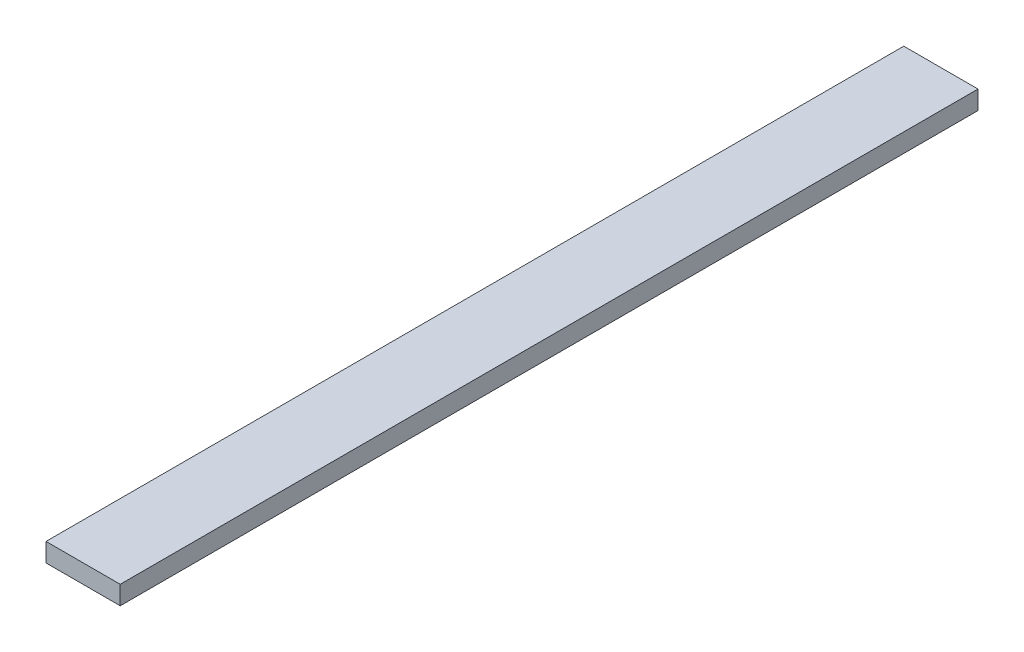
ISO-10303-21;
HEADER;
FILE_DESCRIPTION(('STEP AP214'),'2;1');
FILE_NAME('part.step','',(''),(''),'','','');
FILE_SCHEMA(('AUTOMOTIVE_DESIGN { 1 0 10303 214 1 1 1 1 }'));
ENDSEC;
DATA;
#1=APPLICATION_CONTEXT('core data for automotive mechanical design processes');
#2=APPLICATION_PROTOCOL_DEFINITION('international standard','automotive_design',2000,#1);
#3=PRODUCT_CONTEXT('',#1,'mechanical');
#4=PRODUCT('Part','Part','',(#3));
#5=PRODUCT_RELATED_PRODUCT_CATEGORY('part','',(#4));
#6=PRODUCT_DEFINITION_FORMATION('','',#4);
#7=PRODUCT_DEFINITION_CONTEXT('part definition',#1,'design');
#8=PRODUCT_DEFINITION('design','',#6,#7);
#9=PRODUCT_DEFINITION_SHAPE('','',#8);
#10=(LENGTH_UNIT() NAMED_UNIT(*) SI_UNIT(.MILLI.,.METRE.));
#11=(NAMED_UNIT(*) PLANE_ANGLE_UNIT() SI_UNIT($,.RADIAN.));
#12=(NAMED_UNIT(*) SI_UNIT($,.STERADIAN.) SOLID_ANGLE_UNIT());
#13=UNCERTAINTY_MEASURE_WITH_UNIT(LENGTH_MEASURE(1.E-05),#10,'distance_accuracy_value','');
#14=(GEOMETRIC_REPRESENTATION_CONTEXT(3) GLOBAL_UNCERTAINTY_ASSIGNED_CONTEXT((#13)) GLOBAL_UNIT_ASSIGNED_CONTEXT((#10,
#11,#12)) REPRESENTATION_CONTEXT('',''));
#15=CARTESIAN_POINT('',(0.,0.,0.));
#16=DIRECTION('',(0.,0.,1.));
#17=DIRECTION('',(1.,0.,0.));
#18=AXIS2_PLACEMENT_3D('',#15,#16,#17);
#19=CARTESIAN_POINT('',(234.890488297962,6.35963280943233,32.2183887861911));
#20=DIRECTION('',(0.,0.,-1.));
#21=DIRECTION('',(-1.,0.,0.));
#22=AXIS2_PLACEMENT_3D('',#19,#20,#21);
#23=PLANE('',#22);
#24=DIRECTION('',(1.,0.,0.));
#25=VECTOR('',#24,1.);
#26=CARTESIAN_POINT('',(234.890488297962,0.,32.2183887861911));
#27=LINE('',#26,#25);
#28=CARTESIAN_POINT('',(234.890488297962,0.,32.2183887861911));
#29=VERTEX_POINT('',#28);
#30=CARTESIAN_POINT('',(260.17856152416,0.,32.2183887861911));
#31=VERTEX_POINT('',#30);
#32=EDGE_CURVE('E96',#29,#31,#27,.T.);
#33=ORIENTED_EDGE('',*,*,#32,.T.);
#34=DIRECTION('',(0.,-1.,0.));
#35=VECTOR('',#34,1.);
#36=CARTESIAN_POINT('',(260.17856152416,6.35963280943233,32.2183887861911));
#37=LINE('',#36,#35);
#38=CARTESIAN_POINT('',(260.17856152416,6.35963280943233,32.2183887861911));
#39=VERTEX_POINT('',#38);
#40=EDGE_CURVE('E11',#39,#31,#37,.T.);
#41=ORIENTED_EDGE('',*,*,#40,.F.);
#42=DIRECTION('',(1.,0.,0.));
#43=VECTOR('',#42,1.);
#44=CARTESIAN_POINT('',(234.890488297962,6.35963280943233,32.2183887861911));
#45=LINE('',#44,#43);
#46=CARTESIAN_POINT('',(234.890488297962,6.35963280943233,32.2183887861911));
#47=VERTEX_POINT('',#46);
#48=EDGE_CURVE('E73',#47,#39,#45,.T.);
#49=ORIENTED_EDGE('',*,*,#48,.F.);
#50=DIRECTION('',(0.,-1.,0.));
#51=VECTOR('',#50,1.);
#52=CARTESIAN_POINT('',(234.890488297962,6.35963280943233,32.2183887861911));
#53=LINE('',#52,#51);
#54=EDGE_CURVE('E92',#47,#29,#53,.T.);
#55=ORIENTED_EDGE('',*,*,#54,.T.);
#56=EDGE_LOOP('',(#33,#41,#49,#55));
#57=FACE_BOUND('',#56,.T.);
#58=ADVANCED_FACE('F34',(#57),#23,.F.);
#59=CARTESIAN_POINT('',(260.17856152416,6.35963280943233,-260.051403775776));
#60=DIRECTION('',(1.,0.,0.));
#61=DIRECTION('',(0.,0.,-1.));
#62=AXIS2_PLACEMENT_3D('',#59,#60,#61);
#63=PLANE('',#62);
#64=DIRECTION('',(0.,0.,1.));
#65=VECTOR('',#64,1.);
#66=CARTESIAN_POINT('',(260.17856152416,0.,-260.051403775776));
#67=LINE('',#66,#65);
#68=CARTESIAN_POINT('',(260.17856152416,0.,-260.051403775776));
#69=VERTEX_POINT('',#68);
#70=EDGE_CURVE('E82',#69,#31,#67,.T.);
#71=ORIENTED_EDGE('',*,*,#70,.F.);
#72=DIRECTION('',(0.,-1.,0.));
#73=VECTOR('',#72,1.);
#74=CARTESIAN_POINT('',(260.17856152416,6.35963280943233,-260.051403775776));
#75=LINE('',#74,#73);
#76=CARTESIAN_POINT('',(260.17856152416,6.35963280943233,-260.051403775776));
#77=VERTEX_POINT('',#76);
#78=EDGE_CURVE('E42',#77,#69,#75,.T.);
#79=ORIENTED_EDGE('',*,*,#78,.F.);
#80=DIRECTION('',(0.,0.,1.));
#81=VECTOR('',#80,1.);
#82=CARTESIAN_POINT('',(260.17856152416,6.35963280943233,-260.051403775776));
#83=LINE('',#82,#81);
#84=EDGE_CURVE('E80',#77,#39,#83,.T.);
#85=ORIENTED_EDGE('',*,*,#84,.T.);
#86=ORIENTED_EDGE('',*,*,#40,.T.);
#87=EDGE_LOOP('',(#71,#79,#85,#86));
#88=FACE_BOUND('',#87,.T.);
#89=ADVANCED_FACE('F79',(#88),#63,.T.);
#90=CARTESIAN_POINT('',(234.890488297962,6.35963280943233,-260.051403775776));
#91=DIRECTION('',(0.,0.,-1.));
#92=DIRECTION('',(-1.,0.,0.));
#93=AXIS2_PLACEMENT_3D('',#90,#91,#92);
#94=PLANE('',#93);
#95=DIRECTION('',(1.,0.,0.));
#96=VECTOR('',#95,1.);
#97=CARTESIAN_POINT('',(234.890488297962,0.,-260.051403775776));
#98=LINE('',#97,#96);
#99=CARTESIAN_POINT('',(234.890488297962,0.,-260.051403775776));
#100=VERTEX_POINT('',#99);
#101=EDGE_CURVE('E100',#100,#69,#98,.T.);
#102=ORIENTED_EDGE('',*,*,#101,.F.);
#103=DIRECTION('',(0.,-1.,0.));
#104=VECTOR('',#103,1.);
#105=CARTESIAN_POINT('',(234.890488297962,6.35963280943233,-260.051403775776));
#106=LINE('',#105,#104);
#107=CARTESIAN_POINT('',(234.890488297962,6.35963280943233,-260.051403775776));
#108=VERTEX_POINT('',#107);
#109=EDGE_CURVE('E65',#108,#100,#106,.T.);
#110=ORIENTED_EDGE('',*,*,#109,.F.);
#111=DIRECTION('',(1.,0.,0.));
#112=VECTOR('',#111,1.);
#113=CARTESIAN_POINT('',(234.890488297962,6.35963280943233,-260.051403775776));
#114=LINE('',#113,#112);
#115=EDGE_CURVE('E88',#108,#77,#114,.T.);
#116=ORIENTED_EDGE('',*,*,#115,.T.);
#117=ORIENTED_EDGE('',*,*,#78,.T.);
#118=EDGE_LOOP('',(#102,#110,#116,#117));
#119=FACE_BOUND('',#118,.T.);
#120=ADVANCED_FACE('F90',(#119),#94,.T.);
#121=CARTESIAN_POINT('',(234.890488297962,6.35963280943233,-260.051403775776));
#122=DIRECTION('',(1.,0.,0.));
#123=DIRECTION('',(0.,0.,-1.));
#124=AXIS2_PLACEMENT_3D('',#121,#122,#123);
#125=PLANE('',#124);
#126=DIRECTION('',(0.,0.,1.));
#127=VECTOR('',#126,1.);
#128=CARTESIAN_POINT('',(234.890488297962,0.,-260.051403775776));
#129=LINE('',#128,#127);
#130=EDGE_CURVE('E68',#100,#29,#129,.T.);
#131=ORIENTED_EDGE('',*,*,#130,.T.);
#132=ORIENTED_EDGE('',*,*,#54,.F.);
#133=DIRECTION('',(0.,0.,1.));
#134=VECTOR('',#133,1.);
#135=CARTESIAN_POINT('',(234.890488297962,6.35963280943233,-260.051403775776));
#136=LINE('',#135,#134);
#137=EDGE_CURVE('E50',#108,#47,#136,.T.);
#138=ORIENTED_EDGE('',*,*,#137,.F.);
#139=ORIENTED_EDGE('',*,*,#109,.T.);
#140=EDGE_LOOP('',(#131,#132,#138,#139));
#141=FACE_BOUND('',#140,.T.);
#142=ADVANCED_FACE('F113',(#141),#125,.F.);
#143=CARTESIAN_POINT('',(0.,6.35963280943233,0.));
#144=DIRECTION('',(0.,-1.,0.));
#145=DIRECTION('',(0.,0.,-1.));
#146=AXIS2_PLACEMENT_3D('',#143,#144,#145);
#147=PLANE('',#146);
#148=ORIENTED_EDGE('',*,*,#48,.T.);
#149=ORIENTED_EDGE('',*,*,#84,.F.);
#150=ORIENTED_EDGE('',*,*,#115,.F.);
#151=ORIENTED_EDGE('',*,*,#137,.T.);
#152=EDGE_LOOP('',(#148,#149,#150,#151));
#153=FACE_BOUND('',#152,.T.);
#154=ADVANCED_FACE('F87',(#153),#147,.F.);
#155=CARTESIAN_POINT('',(0.,0.,0.));
#156=DIRECTION('',(0.,-1.,0.));
#157=DIRECTION('',(0.,0.,-1.));
#158=AXIS2_PLACEMENT_3D('',#155,#156,#157);
#159=PLANE('',#158);
#160=ORIENTED_EDGE('',*,*,#32,.F.);
#161=ORIENTED_EDGE('',*,*,#130,.F.);
#162=ORIENTED_EDGE('',*,*,#101,.T.);
#163=ORIENTED_EDGE('',*,*,#70,.T.);
#164=EDGE_LOOP('',(#160,#161,#162,#163));
#165=FACE_BOUND('',#164,.T.);
#166=ADVANCED_FACE('F107',(#165),#159,.T.);
#167=CLOSED_SHELL('',(#58,#89,#120,#142,#154,#166));
#168=MANIFOLD_SOLID_BREP('B2',#167);
#169=ADVANCED_BREP_SHAPE_REPRESENTATION('',(#18,#168),#14);
#170=SHAPE_DEFINITION_REPRESENTATION(#9,#169);
ENDSEC;
END-ISO-10303-21;
